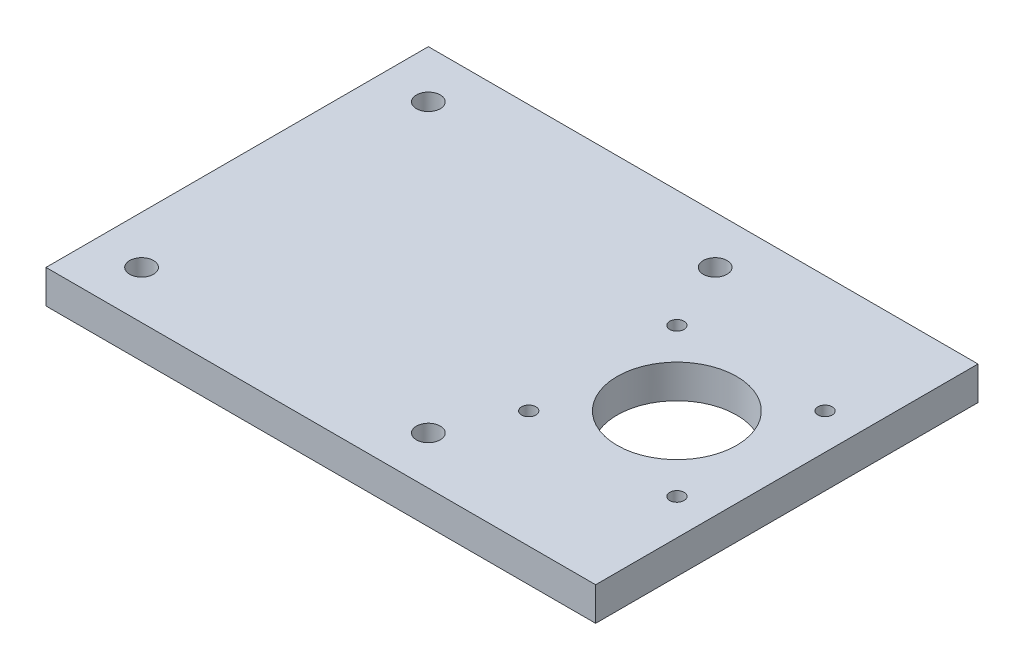
ISO-10303-21;
HEADER;
FILE_DESCRIPTION(('STEP AP214'),'2;1');
FILE_NAME('part.step','',(''),(''),'','','');
FILE_SCHEMA(('AUTOMOTIVE_DESIGN { 1 0 10303 214 1 1 1 1 }'));
ENDSEC;
DATA;
#1=APPLICATION_CONTEXT('core data for automotive mechanical design processes');
#2=APPLICATION_PROTOCOL_DEFINITION('international standard','automotive_design',2000,#1);
#3=PRODUCT_CONTEXT('',#1,'mechanical');
#4=PRODUCT('Part','Part','',(#3));
#5=PRODUCT_RELATED_PRODUCT_CATEGORY('part','',(#4));
#6=PRODUCT_DEFINITION_FORMATION('','',#4);
#7=PRODUCT_DEFINITION_CONTEXT('part definition',#1,'design');
#8=PRODUCT_DEFINITION('design','',#6,#7);
#9=PRODUCT_DEFINITION_SHAPE('','',#8);
#10=(LENGTH_UNIT() NAMED_UNIT(*) SI_UNIT(.MILLI.,.METRE.));
#11=(NAMED_UNIT(*) PLANE_ANGLE_UNIT() SI_UNIT($,.RADIAN.));
#12=(NAMED_UNIT(*) SI_UNIT($,.STERADIAN.) SOLID_ANGLE_UNIT());
#13=UNCERTAINTY_MEASURE_WITH_UNIT(LENGTH_MEASURE(1.E-05),#10,'distance_accuracy_value','');
#14=(GEOMETRIC_REPRESENTATION_CONTEXT(3) GLOBAL_UNCERTAINTY_ASSIGNED_CONTEXT((#13)) GLOBAL_UNIT_ASSIGNED_CONTEXT((#10,
#11,#12)) REPRESENTATION_CONTEXT('',''));
#15=CARTESIAN_POINT('',(0.,0.,0.));
#16=DIRECTION('',(0.,0.,1.));
#17=DIRECTION('',(1.,0.,0.));
#18=AXIS2_PLACEMENT_3D('',#15,#16,#17);
#19=CARTESIAN_POINT('',(0.,7.,-80.));
#20=DIRECTION('',(0.,0.,1.));
#21=DIRECTION('',(1.,0.,0.));
#22=AXIS2_PLACEMENT_3D('',#19,#20,#21);
#23=PLANE('',#22);
#24=DIRECTION('',(-1.,0.,0.));
#25=VECTOR('',#24,1.);
#26=CARTESIAN_POINT('',(0.,0.,-80.));
#27=LINE('',#26,#25);
#28=CARTESIAN_POINT('',(115.,0.,-80.));
#29=VERTEX_POINT('',#28);
#30=CARTESIAN_POINT('',(0.,0.,-80.));
#31=VERTEX_POINT('',#30);
#32=EDGE_CURVE('E103',#29,#31,#27,.T.);
#33=ORIENTED_EDGE('',*,*,#32,.T.);
#34=DIRECTION('',(0.,-1.,0.));
#35=VECTOR('',#34,1.);
#36=CARTESIAN_POINT('',(0.,7.,-80.));
#37=LINE('',#36,#35);
#38=CARTESIAN_POINT('',(0.,7.,-80.));
#39=VERTEX_POINT('',#38);
#40=EDGE_CURVE('E12',#39,#31,#37,.T.);
#41=ORIENTED_EDGE('',*,*,#40,.F.);
#42=DIRECTION('',(-1.,0.,0.));
#43=VECTOR('',#42,1.);
#44=CARTESIAN_POINT('',(0.,7.,-80.));
#45=LINE('',#44,#43);
#46=CARTESIAN_POINT('',(115.,7.,-80.));
#47=VERTEX_POINT('',#46);
#48=EDGE_CURVE('E97',#47,#39,#45,.T.);
#49=ORIENTED_EDGE('',*,*,#48,.F.);
#50=DIRECTION('',(0.,1.,0.));
#51=VECTOR('',#50,1.);
#52=CARTESIAN_POINT('',(115.,0.,-80.));
#53=LINE('',#52,#51);
#54=EDGE_CURVE('E107',#29,#47,#53,.T.);
#55=ORIENTED_EDGE('',*,*,#54,.F.);
#56=EDGE_LOOP('',(#33,#41,#49,#55));
#57=FACE_BOUND('',#56,.T.);
#58=ADVANCED_FACE('F48',(#57),#23,.F.);
#59=CARTESIAN_POINT('',(0.,7.,0.));
#60=DIRECTION('',(-1.,0.,0.));
#61=DIRECTION('',(0.,0.,1.));
#62=AXIS2_PLACEMENT_3D('',#59,#60,#61);
#63=PLANE('',#62);
#64=DIRECTION('',(0.,0.,-1.));
#65=VECTOR('',#64,1.);
#66=CARTESIAN_POINT('',(0.,0.,0.));
#67=LINE('',#66,#65);
#68=CARTESIAN_POINT('',(0.,0.,0.));
#69=VERTEX_POINT('',#68);
#70=EDGE_CURVE('E98',#69,#31,#67,.T.);
#71=ORIENTED_EDGE('',*,*,#70,.F.);
#72=DIRECTION('',(0.,-1.,0.));
#73=VECTOR('',#72,1.);
#74=CARTESIAN_POINT('',(0.,7.,0.));
#75=LINE('',#74,#73);
#76=CARTESIAN_POINT('',(0.,7.,0.));
#77=VERTEX_POINT('',#76);
#78=EDGE_CURVE('E56',#77,#69,#75,.T.);
#79=ORIENTED_EDGE('',*,*,#78,.F.);
#80=DIRECTION('',(0.,0.,-1.));
#81=VECTOR('',#80,1.);
#82=CARTESIAN_POINT('',(0.,7.,0.));
#83=LINE('',#82,#81);
#84=EDGE_CURVE('E153',#77,#39,#83,.T.);
#85=ORIENTED_EDGE('',*,*,#84,.T.);
#86=ORIENTED_EDGE('',*,*,#40,.T.);
#87=EDGE_LOOP('',(#71,#79,#85,#86));
#88=FACE_BOUND('',#87,.T.);
#89=ADVANCED_FACE('F157',(#88),#63,.T.);
#90=CARTESIAN_POINT('',(0.,7.,0.));
#91=DIRECTION('',(0.,0.,1.));
#92=DIRECTION('',(1.,0.,0.));
#93=AXIS2_PLACEMENT_3D('',#90,#91,#92);
#94=PLANE('',#93);
#95=DIRECTION('',(-1.,0.,0.));
#96=VECTOR('',#95,1.);
#97=CARTESIAN_POINT('',(0.,0.,0.));
#98=LINE('',#97,#96);
#99=CARTESIAN_POINT('',(115.,0.,0.));
#100=VERTEX_POINT('',#99);
#101=EDGE_CURVE('E90',#100,#69,#98,.T.);
#102=ORIENTED_EDGE('',*,*,#101,.F.);
#103=DIRECTION('',(0.,-1.,0.));
#104=VECTOR('',#103,1.);
#105=CARTESIAN_POINT('',(115.,0.,0.));
#106=LINE('',#105,#104);
#107=CARTESIAN_POINT('',(115.,7.,0.));
#108=VERTEX_POINT('',#107);
#109=EDGE_CURVE('E94',#108,#100,#106,.T.);
#110=ORIENTED_EDGE('',*,*,#109,.F.);
#111=DIRECTION('',(-1.,0.,0.));
#112=VECTOR('',#111,1.);
#113=CARTESIAN_POINT('',(0.,7.,0.));
#114=LINE('',#113,#112);
#115=EDGE_CURVE('E77',#108,#77,#114,.T.);
#116=ORIENTED_EDGE('',*,*,#115,.T.);
#117=ORIENTED_EDGE('',*,*,#78,.T.);
#118=EDGE_LOOP('',(#102,#110,#116,#117));
#119=FACE_BOUND('',#118,.T.);
#120=ADVANCED_FACE('F92',(#119),#94,.T.);
#121=CARTESIAN_POINT('',(0.,7.,0.));
#122=DIRECTION('',(0.,1.,0.));
#123=DIRECTION('',(0.,0.,1.));
#124=AXIS2_PLACEMENT_3D('',#121,#122,#123);
#125=PLANE('',#124);
#126=CARTESIAN_POINT('',(92.,7.,-40.));
#127=DIRECTION('',(0.,1.,0.));
#128=DIRECTION('',(0.,0.,1.));
#129=AXIS2_PLACEMENT_3D('',#126,#127,#128);
#130=CIRCLE('',#129,12.5);
#131=CARTESIAN_POINT('',(92.,7.,-27.5));
#132=VERTEX_POINT('',#131);
#133=EDGE_CURVE('E111',#132,#132,#130,.T.);
#134=ORIENTED_EDGE('',*,*,#133,.F.);
#135=EDGE_LOOP('',(#134));
#136=FACE_BOUND('',#135,.T.);
#137=CARTESIAN_POINT('',(76.5,7.,-24.5));
#138=DIRECTION('',(0.,1.,0.));
#139=DIRECTION('',(0.,0.,1.));
#140=AXIS2_PLACEMENT_3D('',#137,#138,#139);
#141=CIRCLE('',#140,1.5);
#142=CARTESIAN_POINT('',(76.5,7.,-23.));
#143=VERTEX_POINT('',#142);
#144=EDGE_CURVE('E114',#143,#143,#141,.T.);
#145=ORIENTED_EDGE('',*,*,#144,.F.);
#146=EDGE_LOOP('',(#145));
#147=FACE_BOUND('',#146,.T.);
#148=CARTESIAN_POINT('',(76.5,7.,-55.5));
#149=DIRECTION('',(0.,1.,0.));
#150=DIRECTION('',(0.,0.,1.));
#151=AXIS2_PLACEMENT_3D('',#148,#149,#150);
#152=CIRCLE('',#151,1.5);
#153=CARTESIAN_POINT('',(76.5,7.,-54.));
#154=VERTEX_POINT('',#153);
#155=EDGE_CURVE('E248',#154,#154,#152,.T.);
#156=ORIENTED_EDGE('',*,*,#155,.F.);
#157=EDGE_LOOP('',(#156));
#158=FACE_BOUND('',#157,.T.);
#159=CARTESIAN_POINT('',(107.5,7.,-55.5));
#160=DIRECTION('',(0.,1.,0.));
#161=DIRECTION('',(0.,0.,1.));
#162=AXIS2_PLACEMENT_3D('',#159,#160,#161);
#163=CIRCLE('',#162,1.5);
#164=CARTESIAN_POINT('',(107.5,7.,-54.));
#165=VERTEX_POINT('',#164);
#166=EDGE_CURVE('E215',#165,#165,#163,.T.);
#167=ORIENTED_EDGE('',*,*,#166,.F.);
#168=EDGE_LOOP('',(#167));
#169=FACE_BOUND('',#168,.T.);
#170=CARTESIAN_POINT('',(107.5,7.,-24.5));
#171=DIRECTION('',(0.,1.,0.));
#172=DIRECTION('',(0.,0.,1.));
#173=AXIS2_PLACEMENT_3D('',#170,#171,#172);
#174=CIRCLE('',#173,1.5);
#175=CARTESIAN_POINT('',(107.5,7.,-23.));
#176=VERTEX_POINT('',#175);
#177=EDGE_CURVE('E227',#176,#176,#174,.T.);
#178=ORIENTED_EDGE('',*,*,#177,.F.);
#179=EDGE_LOOP('',(#178));
#180=FACE_BOUND('',#179,.T.);
#181=CARTESIAN_POINT('',(10.,7.,-70.));
#182=DIRECTION('',(0.,1.,0.));
#183=DIRECTION('',(0.,0.,1.));
#184=AXIS2_PLACEMENT_3D('',#181,#182,#183);
#185=CIRCLE('',#184,2.5);
#186=CARTESIAN_POINT('',(10.,7.,-67.5));
#187=VERTEX_POINT('',#186);
#188=EDGE_CURVE('E149',#187,#187,#185,.T.);
#189=ORIENTED_EDGE('',*,*,#188,.F.);
#190=EDGE_LOOP('',(#189));
#191=FACE_BOUND('',#190,.T.);
#192=CARTESIAN_POINT('',(9.99999999999999,7.,-10.));
#193=DIRECTION('',(0.,1.,0.));
#194=DIRECTION('',(0.,0.,1.));
#195=AXIS2_PLACEMENT_3D('',#192,#193,#194);
#196=CIRCLE('',#195,2.5);
#197=CARTESIAN_POINT('',(9.99999999999999,7.,-7.5));
#198=VERTEX_POINT('',#197);
#199=EDGE_CURVE('E146',#198,#198,#196,.T.);
#200=ORIENTED_EDGE('',*,*,#199,.F.);
#201=EDGE_LOOP('',(#200));
#202=FACE_BOUND('',#201,.T.);
#203=CARTESIAN_POINT('',(70.,7.,-10.));
#204=DIRECTION('',(0.,1.,0.));
#205=DIRECTION('',(0.,0.,1.));
#206=AXIS2_PLACEMENT_3D('',#203,#204,#205);
#207=CIRCLE('',#206,2.50000000000001);
#208=CARTESIAN_POINT('',(70.,7.,-7.49999999999999));
#209=VERTEX_POINT('',#208);
#210=EDGE_CURVE('E143',#209,#209,#207,.T.);
#211=ORIENTED_EDGE('',*,*,#210,.F.);
#212=EDGE_LOOP('',(#211));
#213=FACE_BOUND('',#212,.T.);
#214=CARTESIAN_POINT('',(70.,7.,-70.));
#215=DIRECTION('',(0.,1.,0.));
#216=DIRECTION('',(0.,0.,1.));
#217=AXIS2_PLACEMENT_3D('',#214,#215,#216);
#218=CIRCLE('',#217,2.50000000000001);
#219=CARTESIAN_POINT('',(70.,7.,-67.5));
#220=VERTEX_POINT('',#219);
#221=EDGE_CURVE('E139',#220,#220,#218,.T.);
#222=ORIENTED_EDGE('',*,*,#221,.F.);
#223=EDGE_LOOP('',(#222));
#224=FACE_BOUND('',#223,.T.);
#225=ORIENTED_EDGE('',*,*,#115,.F.);
#226=DIRECTION('',(0.,0.,1.));
#227=VECTOR('',#226,1.);
#228=CARTESIAN_POINT('',(115.,7.,0.));
#229=LINE('',#228,#227);
#230=EDGE_CURVE('E110',#47,#108,#229,.T.);
#231=ORIENTED_EDGE('',*,*,#230,.F.);
#232=ORIENTED_EDGE('',*,*,#48,.T.);
#233=ORIENTED_EDGE('',*,*,#84,.F.);
#234=EDGE_LOOP('',(#225,#231,#232,#233));
#235=FACE_BOUND('',#234,.T.);
#236=ADVANCED_FACE('F163',(#136,#147,#158,#169,#180,#191,#202,#213,#224,#235),#125,.T.);
#237=CARTESIAN_POINT('',(0.,0.,0.));
#238=DIRECTION('',(0.,1.,0.));
#239=DIRECTION('',(0.,0.,1.));
#240=AXIS2_PLACEMENT_3D('',#237,#238,#239);
#241=PLANE('',#240);
#242=CARTESIAN_POINT('',(92.,0.,-40.));
#243=DIRECTION('',(0.,-1.,0.));
#244=DIRECTION('',(0.,0.,-1.));
#245=AXIS2_PLACEMENT_3D('',#242,#243,#244);
#246=CIRCLE('',#245,12.5);
#247=CARTESIAN_POINT('',(92.,0.,-52.5));
#248=VERTEX_POINT('',#247);
#249=EDGE_CURVE('E239',#248,#248,#246,.T.);
#250=ORIENTED_EDGE('',*,*,#249,.F.);
#251=EDGE_LOOP('',(#250));
#252=FACE_BOUND('',#251,.T.);
#253=CARTESIAN_POINT('',(76.5,0.,-24.5));
#254=DIRECTION('',(0.,-1.,0.));
#255=DIRECTION('',(0.,0.,-1.));
#256=AXIS2_PLACEMENT_3D('',#253,#254,#255);
#257=CIRCLE('',#256,1.5);
#258=CARTESIAN_POINT('',(76.5,0.,-26.));
#259=VERTEX_POINT('',#258);
#260=EDGE_CURVE('E231',#259,#259,#257,.T.);
#261=ORIENTED_EDGE('',*,*,#260,.F.);
#262=EDGE_LOOP('',(#261));
#263=FACE_BOUND('',#262,.T.);
#264=CARTESIAN_POINT('',(76.5,0.,-55.5));
#265=DIRECTION('',(0.,-1.,0.));
#266=DIRECTION('',(0.,0.,-1.));
#267=AXIS2_PLACEMENT_3D('',#264,#265,#266);
#268=CIRCLE('',#267,1.5);
#269=CARTESIAN_POINT('',(76.5,0.,-57.));
#270=VERTEX_POINT('',#269);
#271=EDGE_CURVE('E222',#270,#270,#268,.T.);
#272=ORIENTED_EDGE('',*,*,#271,.F.);
#273=EDGE_LOOP('',(#272));
#274=FACE_BOUND('',#273,.T.);
#275=CARTESIAN_POINT('',(107.5,0.,-55.5));
#276=DIRECTION('',(0.,-1.,0.));
#277=DIRECTION('',(0.,0.,-1.));
#278=AXIS2_PLACEMENT_3D('',#275,#276,#277);
#279=CIRCLE('',#278,1.5);
#280=CARTESIAN_POINT('',(107.5,0.,-57.));
#281=VERTEX_POINT('',#280);
#282=EDGE_CURVE('E218',#281,#281,#279,.T.);
#283=ORIENTED_EDGE('',*,*,#282,.F.);
#284=EDGE_LOOP('',(#283));
#285=FACE_BOUND('',#284,.T.);
#286=CARTESIAN_POINT('',(107.5,0.,-24.5));
#287=DIRECTION('',(0.,-1.,0.));
#288=DIRECTION('',(0.,0.,-1.));
#289=AXIS2_PLACEMENT_3D('',#286,#287,#288);
#290=CIRCLE('',#289,1.5);
#291=CARTESIAN_POINT('',(107.5,0.,-26.));
#292=VERTEX_POINT('',#291);
#293=EDGE_CURVE('E221',#292,#292,#290,.T.);
#294=ORIENTED_EDGE('',*,*,#293,.F.);
#295=EDGE_LOOP('',(#294));
#296=FACE_BOUND('',#295,.T.);
#297=CARTESIAN_POINT('',(10.,0.,-70.));
#298=DIRECTION('',(0.,-1.,0.));
#299=DIRECTION('',(0.,0.,-1.));
#300=AXIS2_PLACEMENT_3D('',#297,#298,#299);
#301=CIRCLE('',#300,2.5);
#302=CARTESIAN_POINT('',(10.,0.,-72.5));
#303=VERTEX_POINT('',#302);
#304=EDGE_CURVE('E120',#303,#303,#301,.T.);
#305=ORIENTED_EDGE('',*,*,#304,.F.);
#306=EDGE_LOOP('',(#305));
#307=FACE_BOUND('',#306,.T.);
#308=CARTESIAN_POINT('',(9.99999999999999,0.,-10.));
#309=DIRECTION('',(0.,-1.,0.));
#310=DIRECTION('',(0.,0.,-1.));
#311=AXIS2_PLACEMENT_3D('',#308,#309,#310);
#312=CIRCLE('',#311,2.5);
#313=CARTESIAN_POINT('',(9.99999999999999,0.,-12.5));
#314=VERTEX_POINT('',#313);
#315=EDGE_CURVE('E127',#314,#314,#312,.T.);
#316=ORIENTED_EDGE('',*,*,#315,.F.);
#317=EDGE_LOOP('',(#316));
#318=FACE_BOUND('',#317,.T.);
#319=CARTESIAN_POINT('',(70.,0.,-10.));
#320=DIRECTION('',(0.,-1.,0.));
#321=DIRECTION('',(0.,0.,-1.));
#322=AXIS2_PLACEMENT_3D('',#319,#320,#321);
#323=CIRCLE('',#322,2.50000000000001);
#324=CARTESIAN_POINT('',(70.,0.,-12.5));
#325=VERTEX_POINT('',#324);
#326=EDGE_CURVE('E121',#325,#325,#323,.T.);
#327=ORIENTED_EDGE('',*,*,#326,.F.);
#328=EDGE_LOOP('',(#327));
#329=FACE_BOUND('',#328,.T.);
#330=CARTESIAN_POINT('',(70.,0.,-70.));
#331=DIRECTION('',(0.,-1.,0.));
#332=DIRECTION('',(0.,0.,-1.));
#333=AXIS2_PLACEMENT_3D('',#330,#331,#332);
#334=CIRCLE('',#333,2.50000000000001);
#335=CARTESIAN_POINT('',(70.,0.,-72.5));
#336=VERTEX_POINT('',#335);
#337=EDGE_CURVE('E126',#336,#336,#334,.T.);
#338=ORIENTED_EDGE('',*,*,#337,.F.);
#339=EDGE_LOOP('',(#338));
#340=FACE_BOUND('',#339,.T.);
#341=ORIENTED_EDGE('',*,*,#32,.F.);
#342=DIRECTION('',(0.,0.,-1.));
#343=VECTOR('',#342,1.);
#344=CARTESIAN_POINT('',(115.,0.,0.));
#345=LINE('',#344,#343);
#346=EDGE_CURVE('E101',#100,#29,#345,.T.);
#347=ORIENTED_EDGE('',*,*,#346,.F.);
#348=ORIENTED_EDGE('',*,*,#101,.T.);
#349=ORIENTED_EDGE('',*,*,#70,.T.);
#350=EDGE_LOOP('',(#341,#347,#348,#349));
#351=FACE_BOUND('',#350,.T.);
#352=ADVANCED_FACE('F102',(#252,#263,#274,#285,#296,#307,#318,#329,#340,#351),#241,.F.);
#353=CARTESIAN_POINT('',(70.,10.,-70.));
#354=DIRECTION('',(0.,-1.,0.));
#355=DIRECTION('',(0.,0.,-1.));
#356=AXIS2_PLACEMENT_3D('',#353,#354,#355);
#357=CYLINDRICAL_SURFACE('',#356,2.50000000000001);
#358=ORIENTED_EDGE('',*,*,#221,.T.);
#359=EDGE_LOOP('',(#358));
#360=FACE_BOUND('',#359,.T.);
#361=ORIENTED_EDGE('',*,*,#337,.T.);
#362=EDGE_LOOP('',(#361));
#363=FACE_BOUND('',#362,.T.);
#364=ADVANCED_FACE('F169',(#360,#363),#357,.F.);
#365=CARTESIAN_POINT('',(70.,10.,-10.));
#366=DIRECTION('',(0.,-1.,0.));
#367=DIRECTION('',(0.,0.,-1.));
#368=AXIS2_PLACEMENT_3D('',#365,#366,#367);
#369=CYLINDRICAL_SURFACE('',#368,2.50000000000001);
#370=ORIENTED_EDGE('',*,*,#210,.T.);
#371=EDGE_LOOP('',(#370));
#372=FACE_BOUND('',#371,.T.);
#373=ORIENTED_EDGE('',*,*,#326,.T.);
#374=EDGE_LOOP('',(#373));
#375=FACE_BOUND('',#374,.T.);
#376=ADVANCED_FACE('F176',(#372,#375),#369,.F.);
#377=CARTESIAN_POINT('',(9.99999999999999,10.,-10.));
#378=DIRECTION('',(0.,-1.,0.));
#379=DIRECTION('',(0.,0.,-1.));
#380=AXIS2_PLACEMENT_3D('',#377,#378,#379);
#381=CYLINDRICAL_SURFACE('',#380,2.5);
#382=ORIENTED_EDGE('',*,*,#199,.T.);
#383=EDGE_LOOP('',(#382));
#384=FACE_BOUND('',#383,.T.);
#385=ORIENTED_EDGE('',*,*,#315,.T.);
#386=EDGE_LOOP('',(#385));
#387=FACE_BOUND('',#386,.T.);
#388=ADVANCED_FACE('F181',(#384,#387),#381,.F.);
#389=CARTESIAN_POINT('',(10.,10.,-70.));
#390=DIRECTION('',(0.,-1.,0.));
#391=DIRECTION('',(0.,0.,-1.));
#392=AXIS2_PLACEMENT_3D('',#389,#390,#391);
#393=CYLINDRICAL_SURFACE('',#392,2.5);
#394=ORIENTED_EDGE('',*,*,#188,.T.);
#395=EDGE_LOOP('',(#394));
#396=FACE_BOUND('',#395,.T.);
#397=ORIENTED_EDGE('',*,*,#304,.T.);
#398=EDGE_LOOP('',(#397));
#399=FACE_BOUND('',#398,.T.);
#400=ADVANCED_FACE('F178',(#396,#399),#393,.F.);
#401=CARTESIAN_POINT('',(115.,0.,0.));
#402=DIRECTION('',(-1.,0.,0.));
#403=DIRECTION('',(0.,0.,1.));
#404=AXIS2_PLACEMENT_3D('',#401,#402,#403);
#405=PLANE('',#404);
#406=ORIENTED_EDGE('',*,*,#109,.T.);
#407=ORIENTED_EDGE('',*,*,#346,.T.);
#408=ORIENTED_EDGE('',*,*,#54,.T.);
#409=ORIENTED_EDGE('',*,*,#230,.T.);
#410=EDGE_LOOP('',(#406,#407,#408,#409));
#411=FACE_BOUND('',#410,.T.);
#412=ADVANCED_FACE('F109',(#411),#405,.F.);
#413=CARTESIAN_POINT('',(107.5,10.,-24.5));
#414=DIRECTION('',(0.,-1.,0.));
#415=DIRECTION('',(0.,0.,-1.));
#416=AXIS2_PLACEMENT_3D('',#413,#414,#415);
#417=CYLINDRICAL_SURFACE('',#416,1.5);
#418=ORIENTED_EDGE('',*,*,#177,.T.);
#419=EDGE_LOOP('',(#418));
#420=FACE_BOUND('',#419,.T.);
#421=ORIENTED_EDGE('',*,*,#293,.T.);
#422=EDGE_LOOP('',(#421));
#423=FACE_BOUND('',#422,.T.);
#424=ADVANCED_FACE('F191',(#420,#423),#417,.F.);
#425=CARTESIAN_POINT('',(107.5,10.,-55.5));
#426=DIRECTION('',(0.,-1.,0.));
#427=DIRECTION('',(0.,0.,-1.));
#428=AXIS2_PLACEMENT_3D('',#425,#426,#427);
#429=CYLINDRICAL_SURFACE('',#428,1.5);
#430=ORIENTED_EDGE('',*,*,#166,.T.);
#431=EDGE_LOOP('',(#430));
#432=FACE_BOUND('',#431,.T.);
#433=ORIENTED_EDGE('',*,*,#282,.T.);
#434=EDGE_LOOP('',(#433));
#435=FACE_BOUND('',#434,.T.);
#436=ADVANCED_FACE('F194',(#432,#435),#429,.F.);
#437=CARTESIAN_POINT('',(76.5,10.,-55.5));
#438=DIRECTION('',(0.,-1.,0.));
#439=DIRECTION('',(0.,0.,-1.));
#440=AXIS2_PLACEMENT_3D('',#437,#438,#439);
#441=CYLINDRICAL_SURFACE('',#440,1.5);
#442=ORIENTED_EDGE('',*,*,#155,.T.);
#443=EDGE_LOOP('',(#442));
#444=FACE_BOUND('',#443,.T.);
#445=ORIENTED_EDGE('',*,*,#271,.T.);
#446=EDGE_LOOP('',(#445));
#447=FACE_BOUND('',#446,.T.);
#448=ADVANCED_FACE('F203',(#444,#447),#441,.F.);
#449=CARTESIAN_POINT('',(76.5,10.,-24.5));
#450=DIRECTION('',(0.,-1.,0.));
#451=DIRECTION('',(0.,0.,-1.));
#452=AXIS2_PLACEMENT_3D('',#449,#450,#451);
#453=CYLINDRICAL_SURFACE('',#452,1.5);
#454=ORIENTED_EDGE('',*,*,#144,.T.);
#455=EDGE_LOOP('',(#454));
#456=FACE_BOUND('',#455,.T.);
#457=ORIENTED_EDGE('',*,*,#260,.T.);
#458=EDGE_LOOP('',(#457));
#459=FACE_BOUND('',#458,.T.);
#460=ADVANCED_FACE('F199',(#456,#459),#453,.F.);
#461=CARTESIAN_POINT('',(92.,10.,-40.));
#462=DIRECTION('',(0.,-1.,0.));
#463=DIRECTION('',(0.,0.,-1.));
#464=AXIS2_PLACEMENT_3D('',#461,#462,#463);
#465=CYLINDRICAL_SURFACE('',#464,12.5);
#466=ORIENTED_EDGE('',*,*,#133,.T.);
#467=EDGE_LOOP('',(#466));
#468=FACE_BOUND('',#467,.T.);
#469=ORIENTED_EDGE('',*,*,#249,.T.);
#470=EDGE_LOOP('',(#469));
#471=FACE_BOUND('',#470,.T.);
#472=ADVANCED_FACE('F196',(#468,#471),#465,.F.);
#473=CLOSED_SHELL('',(#58,#89,#120,#236,#352,#364,#376,#388,#400,#412,#424,#436,#448,#460,#472));
#474=MANIFOLD_SOLID_BREP('B2',#473);
#475=ADVANCED_BREP_SHAPE_REPRESENTATION('',(#18,#474),#14);
#476=SHAPE_DEFINITION_REPRESENTATION(#9,#475);
ENDSEC;
END-ISO-10303-21;
